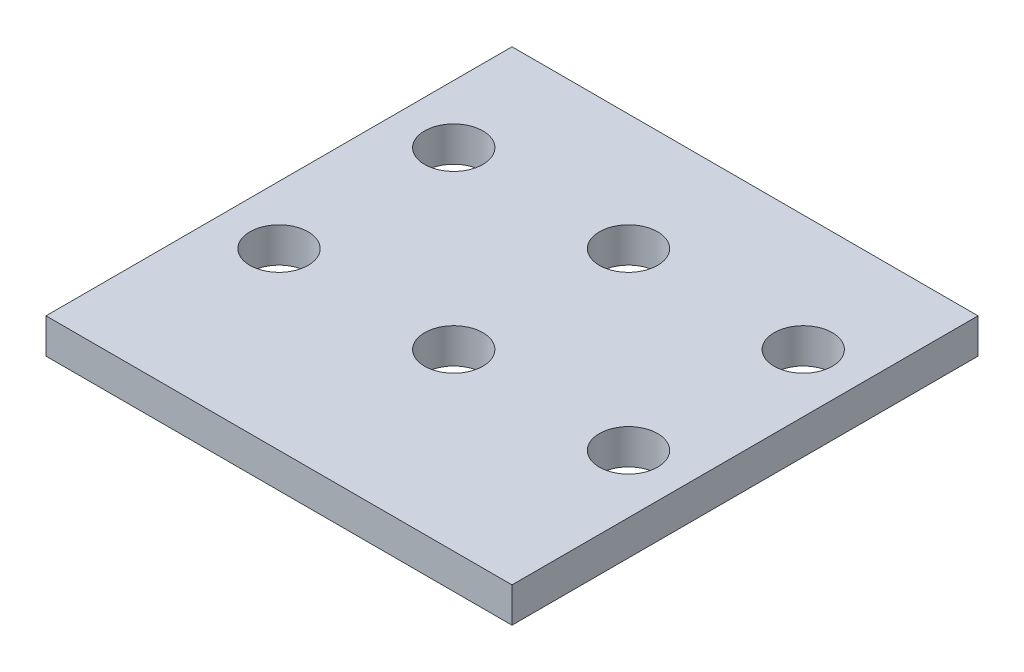
ISO-10303-21;
HEADER;
FILE_DESCRIPTION(('STEP AP214'),'2;1');
FILE_NAME('part.step','',(''),(''),'','','');
FILE_SCHEMA(('AUTOMOTIVE_DESIGN { 1 0 10303 214 1 1 1 1 }'));
ENDSEC;
DATA;
#1=APPLICATION_CONTEXT('core data for automotive mechanical design processes');
#2=APPLICATION_PROTOCOL_DEFINITION('international standard','automotive_design',2000,#1);
#3=PRODUCT_CONTEXT('',#1,'mechanical');
#4=PRODUCT('Part','Part','',(#3));
#5=PRODUCT_RELATED_PRODUCT_CATEGORY('part','',(#4));
#6=PRODUCT_DEFINITION_FORMATION('','',#4);
#7=PRODUCT_DEFINITION_CONTEXT('part definition',#1,'design');
#8=PRODUCT_DEFINITION('design','',#6,#7);
#9=PRODUCT_DEFINITION_SHAPE('','',#8);
#10=(LENGTH_UNIT() NAMED_UNIT(*) SI_UNIT(.MILLI.,.METRE.));
#11=(NAMED_UNIT(*) PLANE_ANGLE_UNIT() SI_UNIT($,.RADIAN.));
#12=(NAMED_UNIT(*) SI_UNIT($,.STERADIAN.) SOLID_ANGLE_UNIT());
#13=UNCERTAINTY_MEASURE_WITH_UNIT(LENGTH_MEASURE(1.E-05),#10,'distance_accuracy_value','');
#14=(GEOMETRIC_REPRESENTATION_CONTEXT(3) GLOBAL_UNCERTAINTY_ASSIGNED_CONTEXT((#13)) GLOBAL_UNIT_ASSIGNED_CONTEXT((#10,
#11,#12)) REPRESENTATION_CONTEXT('',''));
#15=CARTESIAN_POINT('',(0.,0.,0.));
#16=DIRECTION('',(0.,0.,1.));
#17=DIRECTION('',(1.,0.,0.));
#18=AXIS2_PLACEMENT_3D('',#15,#16,#17);
#19=CARTESIAN_POINT('',(19.05,0.,-12.7));
#20=DIRECTION('',(0.,1.,0.));
#21=DIRECTION('',(0.,0.,1.));
#22=AXIS2_PLACEMENT_3D('',#19,#20,#21);
#23=CYLINDRICAL_SURFACE('',#22,3.175);
#24=CARTESIAN_POINT('',(19.05,0.,-12.7));
#25=DIRECTION('',(0.,1.,0.));
#26=DIRECTION('',(0.,0.,1.));
#27=AXIS2_PLACEMENT_3D('',#24,#25,#26);
#28=CIRCLE('',#27,3.175);
#29=CARTESIAN_POINT('',(19.05,0.,-9.525));
#30=VERTEX_POINT('',#29);
#31=EDGE_CURVE('E45',#30,#30,#28,.T.);
#32=CARTESIAN_POINT('',(19.05,3.81,-12.7));
#33=DIRECTION('',(0.,1.,0.));
#34=DIRECTION('',(0.,0.,1.));
#35=AXIS2_PLACEMENT_3D('',#32,#33,#34);
#36=CIRCLE('',#35,3.175);
#37=CARTESIAN_POINT('',(19.05,3.81,-9.525));
#38=VERTEX_POINT('',#37);
#39=EDGE_CURVE('E11',#38,#38,#36,.T.);
#40=CARTESIAN_POINT('',(19.05,0.,-9.525));
#41=CARTESIAN_POINT('',(19.05,0.0396874999999999,-9.525));
#42=CARTESIAN_POINT('',(19.05,0.079375,-9.525));
#43=CARTESIAN_POINT('',(19.05,0.15875,-9.525));
#44=CARTESIAN_POINT('',(19.05,0.1984375,-9.525));
#45=CARTESIAN_POINT('',(19.05,0.2778125,-9.525));
#46=CARTESIAN_POINT('',(19.05,0.3175,-9.525));
#47=CARTESIAN_POINT('',(19.05,0.396875,-9.525));
#48=CARTESIAN_POINT('',(19.05,0.4365625,-9.525));
#49=CARTESIAN_POINT('',(19.05,0.5159375,-9.525));
#50=CARTESIAN_POINT('',(19.05,0.555625,-9.525));
#51=CARTESIAN_POINT('',(19.05,0.635,-9.525));
#52=CARTESIAN_POINT('',(19.05,0.6746875,-9.525));
#53=CARTESIAN_POINT('',(19.05,0.7540625,-9.525));
#54=CARTESIAN_POINT('',(19.05,0.79375,-9.525));
#55=CARTESIAN_POINT('',(19.05,0.873125,-9.525));
#56=CARTESIAN_POINT('',(19.05,0.9128125,-9.525));
#57=CARTESIAN_POINT('',(19.05,0.9921875,-9.525));
#58=CARTESIAN_POINT('',(19.05,1.031875,-9.525));
#59=CARTESIAN_POINT('',(19.05,1.11125,-9.525));
#60=CARTESIAN_POINT('',(19.05,1.1509375,-9.525));
#61=CARTESIAN_POINT('',(19.05,1.2303125,-9.525));
#62=CARTESIAN_POINT('',(19.05,1.27,-9.525));
#63=CARTESIAN_POINT('',(19.05,1.349375,-9.525));
#64=CARTESIAN_POINT('',(19.05,1.3890625,-9.525));
#65=CARTESIAN_POINT('',(19.05,1.4684375,-9.525));
#66=CARTESIAN_POINT('',(19.05,1.508125,-9.525));
#67=CARTESIAN_POINT('',(19.05,1.5875,-9.525));
#68=CARTESIAN_POINT('',(19.05,1.6271875,-9.525));
#69=CARTESIAN_POINT('',(19.05,1.7065625,-9.525));
#70=CARTESIAN_POINT('',(19.05,1.74625,-9.525));
#71=CARTESIAN_POINT('',(19.05,1.825625,-9.525));
#72=CARTESIAN_POINT('',(19.05,1.8653125,-9.525));
#73=CARTESIAN_POINT('',(19.05,1.9446875,-9.525));
#74=CARTESIAN_POINT('',(19.05,1.984375,-9.525));
#75=CARTESIAN_POINT('',(19.05,2.06375,-9.525));
#76=CARTESIAN_POINT('',(19.05,2.1034375,-9.525));
#77=CARTESIAN_POINT('',(19.05,2.1828125,-9.525));
#78=CARTESIAN_POINT('',(19.05,2.2225,-9.525));
#79=CARTESIAN_POINT('',(19.05,2.301875,-9.525));
#80=CARTESIAN_POINT('',(19.05,2.3415625,-9.525));
#81=CARTESIAN_POINT('',(19.05,2.4209375,-9.525));
#82=CARTESIAN_POINT('',(19.05,2.460625,-9.525));
#83=CARTESIAN_POINT('',(19.05,2.54,-9.525));
#84=CARTESIAN_POINT('',(19.05,2.5796875,-9.525));
#85=CARTESIAN_POINT('',(19.05,2.6590625,-9.525));
#86=CARTESIAN_POINT('',(19.05,2.69875,-9.525));
#87=CARTESIAN_POINT('',(19.05,2.778125,-9.525));
#88=CARTESIAN_POINT('',(19.05,2.8178125,-9.525));
#89=CARTESIAN_POINT('',(19.05,2.8971875,-9.525));
#90=CARTESIAN_POINT('',(19.05,2.936875,-9.525));
#91=CARTESIAN_POINT('',(19.05,3.01625,-9.525));
#92=CARTESIAN_POINT('',(19.05,3.0559375,-9.525));
#93=CARTESIAN_POINT('',(19.05,3.1353125,-9.525));
#94=CARTESIAN_POINT('',(19.05,3.175,-9.525));
#95=CARTESIAN_POINT('',(19.05,3.254375,-9.525));
#96=CARTESIAN_POINT('',(19.05,3.2940625,-9.525));
#97=CARTESIAN_POINT('',(19.05,3.3734375,-9.525));
#98=CARTESIAN_POINT('',(19.05,3.413125,-9.525));
#99=CARTESIAN_POINT('',(19.05,3.4925,-9.525));
#100=CARTESIAN_POINT('',(19.05,3.5321875,-9.525));
#101=CARTESIAN_POINT('',(19.05,3.6115625,-9.525));
#102=CARTESIAN_POINT('',(19.05,3.65125,-9.525));
#103=CARTESIAN_POINT('',(19.05,3.730625,-9.525));
#104=CARTESIAN_POINT('',(19.05,3.7703125,-9.525));
#105=CARTESIAN_POINT('',(19.05,3.81,-9.525));
#106=B_SPLINE_CURVE_WITH_KNOTS('',3,(#40,#41,#42,#43,#44,#45,#46,#47,#48,#49,#50,#51,#52,#53,
#54,#55,#56,#57,#58,#59,#60,#61,#62,#63,#64,#65,#66,#67,#68,#69,#70,#71,#72,#73,#74,#75,#76,#77,
#78,#79,#80,#81,#82,#83,#84,#85,#86,#87,#88,#89,#90,#91,#92,#93,#94,#95,#96,#97,#98,#99,#100,
#101,#102,#103,#104,#105),.UNSPECIFIED.,.F.,.F.,(4,2,2,2,2,2,2,2,2,2,2,2,2,2,2,2,2,2,2,2,2,2,2,
2,2,2,2,2,2,2,2,2,4),(0.,0.1190625,0.238125,0.3571875,0.47625,0.5953125,0.714375,0.8334375,
0.9525,1.0715625,1.190625,1.3096875,1.42875,1.5478125,1.666875,1.7859375,1.905,2.0240625,
2.143125,2.2621875,2.38125,2.5003125,2.619375,2.7384375,2.8575,2.9765625,3.095625,3.2146875,
3.33375,3.4528125,3.571875,3.6909375,3.81),.UNSPECIFIED.);
#107=EDGE_CURVE('BSEAM37',#30,#38,#106,.T.);
#108=ORIENTED_EDGE('',*,*,#31,.F.);
#109=ORIENTED_EDGE('',*,*,#39,.T.);
#110=ORIENTED_EDGE('',*,*,#107,.T.);
#111=ORIENTED_EDGE('',*,*,#107,.F.);
#112=EDGE_LOOP('',(#108,#110,#109,#111));
#113=FACE_BOUND('',#112,.T.);
#114=ADVANCED_FACE('F37',(#113),#23,.F.);
#115=CARTESIAN_POINT('',(19.05,0.,6.35));
#116=DIRECTION('',(0.,1.,0.));
#117=DIRECTION('',(0.,0.,1.));
#118=AXIS2_PLACEMENT_3D('',#115,#116,#117);
#119=CYLINDRICAL_SURFACE('',#118,3.175);
#120=CARTESIAN_POINT('',(19.05,0.,6.35));
#121=DIRECTION('',(0.,1.,0.));
#122=DIRECTION('',(0.,0.,1.));
#123=AXIS2_PLACEMENT_3D('',#120,#121,#122);
#124=CIRCLE('',#123,3.175);
#125=CARTESIAN_POINT('',(19.05,0.,9.525));
#126=VERTEX_POINT('',#125);
#127=EDGE_CURVE('E127',#126,#126,#124,.T.);
#128=CARTESIAN_POINT('',(19.05,3.81,6.35));
#129=DIRECTION('',(0.,1.,0.));
#130=DIRECTION('',(0.,0.,1.));
#131=AXIS2_PLACEMENT_3D('',#128,#129,#130);
#132=CIRCLE('',#131,3.175);
#133=CARTESIAN_POINT('',(19.05,3.81,9.525));
#134=VERTEX_POINT('',#133);
#135=EDGE_CURVE('E130',#134,#134,#132,.T.);
#136=CARTESIAN_POINT('',(19.05,0.,9.525));
#137=CARTESIAN_POINT('',(19.05,0.0396874999999999,9.525));
#138=CARTESIAN_POINT('',(19.05,0.079375,9.525));
#139=CARTESIAN_POINT('',(19.05,0.15875,9.525));
#140=CARTESIAN_POINT('',(19.05,0.1984375,9.525));
#141=CARTESIAN_POINT('',(19.05,0.2778125,9.525));
#142=CARTESIAN_POINT('',(19.05,0.3175,9.525));
#143=CARTESIAN_POINT('',(19.05,0.396875,9.525));
#144=CARTESIAN_POINT('',(19.05,0.4365625,9.525));
#145=CARTESIAN_POINT('',(19.05,0.5159375,9.525));
#146=CARTESIAN_POINT('',(19.05,0.555625,9.525));
#147=CARTESIAN_POINT('',(19.05,0.635,9.525));
#148=CARTESIAN_POINT('',(19.05,0.6746875,9.525));
#149=CARTESIAN_POINT('',(19.05,0.7540625,9.525));
#150=CARTESIAN_POINT('',(19.05,0.79375,9.525));
#151=CARTESIAN_POINT('',(19.05,0.873125,9.525));
#152=CARTESIAN_POINT('',(19.05,0.9128125,9.525));
#153=CARTESIAN_POINT('',(19.05,0.9921875,9.525));
#154=CARTESIAN_POINT('',(19.05,1.031875,9.525));
#155=CARTESIAN_POINT('',(19.05,1.11125,9.525));
#156=CARTESIAN_POINT('',(19.05,1.1509375,9.525));
#157=CARTESIAN_POINT('',(19.05,1.2303125,9.525));
#158=CARTESIAN_POINT('',(19.05,1.27,9.525));
#159=CARTESIAN_POINT('',(19.05,1.349375,9.525));
#160=CARTESIAN_POINT('',(19.05,1.3890625,9.525));
#161=CARTESIAN_POINT('',(19.05,1.4684375,9.525));
#162=CARTESIAN_POINT('',(19.05,1.508125,9.525));
#163=CARTESIAN_POINT('',(19.05,1.5875,9.525));
#164=CARTESIAN_POINT('',(19.05,1.6271875,9.525));
#165=CARTESIAN_POINT('',(19.05,1.7065625,9.525));
#166=CARTESIAN_POINT('',(19.05,1.74625,9.525));
#167=CARTESIAN_POINT('',(19.05,1.825625,9.525));
#168=CARTESIAN_POINT('',(19.05,1.8653125,9.525));
#169=CARTESIAN_POINT('',(19.05,1.9446875,9.525));
#170=CARTESIAN_POINT('',(19.05,1.984375,9.525));
#171=CARTESIAN_POINT('',(19.05,2.06375,9.525));
#172=CARTESIAN_POINT('',(19.05,2.1034375,9.525));
#173=CARTESIAN_POINT('',(19.05,2.1828125,9.525));
#174=CARTESIAN_POINT('',(19.05,2.2225,9.525));
#175=CARTESIAN_POINT('',(19.05,2.301875,9.525));
#176=CARTESIAN_POINT('',(19.05,2.3415625,9.525));
#177=CARTESIAN_POINT('',(19.05,2.4209375,9.525));
#178=CARTESIAN_POINT('',(19.05,2.460625,9.525));
#179=CARTESIAN_POINT('',(19.05,2.54,9.525));
#180=CARTESIAN_POINT('',(19.05,2.5796875,9.525));
#181=CARTESIAN_POINT('',(19.05,2.6590625,9.525));
#182=CARTESIAN_POINT('',(19.05,2.69875,9.525));
#183=CARTESIAN_POINT('',(19.05,2.778125,9.525));
#184=CARTESIAN_POINT('',(19.05,2.8178125,9.525));
#185=CARTESIAN_POINT('',(19.05,2.8971875,9.525));
#186=CARTESIAN_POINT('',(19.05,2.936875,9.525));
#187=CARTESIAN_POINT('',(19.05,3.01625,9.525));
#188=CARTESIAN_POINT('',(19.05,3.0559375,9.525));
#189=CARTESIAN_POINT('',(19.05,3.1353125,9.525));
#190=CARTESIAN_POINT('',(19.05,3.175,9.525));
#191=CARTESIAN_POINT('',(19.05,3.254375,9.525));
#192=CARTESIAN_POINT('',(19.05,3.2940625,9.525));
#193=CARTESIAN_POINT('',(19.05,3.3734375,9.525));
#194=CARTESIAN_POINT('',(19.05,3.413125,9.525));
#195=CARTESIAN_POINT('',(19.05,3.4925,9.525));
#196=CARTESIAN_POINT('',(19.05,3.5321875,9.525));
#197=CARTESIAN_POINT('',(19.05,3.6115625,9.525));
#198=CARTESIAN_POINT('',(19.05,3.65125,9.525));
#199=CARTESIAN_POINT('',(19.05,3.730625,9.525));
#200=CARTESIAN_POINT('',(19.05,3.7703125,9.525));
#201=CARTESIAN_POINT('',(19.05,3.81,9.525));
#202=B_SPLINE_CURVE_WITH_KNOTS('',3,(#136,#137,#138,#139,#140,#141,#142,#143,#144,#145,#146,
#147,#148,#149,#150,#151,#152,#153,#154,#155,#156,#157,#158,#159,#160,#161,#162,#163,#164,#165,
#166,#167,#168,#169,#170,#171,#172,#173,#174,#175,#176,#177,#178,#179,#180,#181,#182,#183,#184,
#185,#186,#187,#188,#189,#190,#191,#192,#193,#194,#195,#196,#197,#198,#199,#200,#201),
.UNSPECIFIED.,.F.,.F.,(4,2,2,2,2,2,2,2,2,2,2,2,2,2,2,2,2,2,2,2,2,2,2,2,2,2,2,2,2,2,2,2,4),(0.,
0.1190625,0.238125,0.3571875,0.47625,0.5953125,0.714375,0.8334375,0.9525,1.0715625,1.190625,
1.3096875,1.42875,1.5478125,1.666875,1.7859375,1.905,2.0240625,2.143125,2.2621875,2.38125,
2.5003125,2.619375,2.7384375,2.8575,2.9765625,3.095625,3.2146875,3.33375,3.4528125,3.571875,
3.6909375,3.81),.UNSPECIFIED.);
#203=EDGE_CURVE('BSEAM139',#126,#134,#202,.T.);
#204=ORIENTED_EDGE('',*,*,#127,.F.);
#205=ORIENTED_EDGE('',*,*,#135,.T.);
#206=ORIENTED_EDGE('',*,*,#203,.T.);
#207=ORIENTED_EDGE('',*,*,#203,.F.);
#208=EDGE_LOOP('',(#204,#206,#205,#207));
#209=FACE_BOUND('',#208,.T.);
#210=ADVANCED_FACE('F139',(#209),#119,.F.);
#211=CARTESIAN_POINT('',(0.,0.,-12.7));
#212=DIRECTION('',(0.,1.,0.));
#213=DIRECTION('',(0.,0.,1.));
#214=AXIS2_PLACEMENT_3D('',#211,#212,#213);
#215=CYLINDRICAL_SURFACE('',#214,3.175);
#216=CARTESIAN_POINT('',(0.,0.,-12.7));
#217=DIRECTION('',(0.,1.,0.));
#218=DIRECTION('',(0.,0.,1.));
#219=AXIS2_PLACEMENT_3D('',#216,#217,#218);
#220=CIRCLE('',#219,3.175);
#221=CARTESIAN_POINT('',(0.,0.,-9.525));
#222=VERTEX_POINT('',#221);
#223=EDGE_CURVE('E121',#222,#222,#220,.T.);
#224=CARTESIAN_POINT('',(0.,3.81,-12.7));
#225=DIRECTION('',(0.,1.,0.));
#226=DIRECTION('',(0.,0.,1.));
#227=AXIS2_PLACEMENT_3D('',#224,#225,#226);
#228=CIRCLE('',#227,3.175);
#229=CARTESIAN_POINT('',(0.,3.81,-9.525));
#230=VERTEX_POINT('',#229);
#231=EDGE_CURVE('E124',#230,#230,#228,.T.);
#232=CARTESIAN_POINT('',(0.,0.,-9.525));
#233=CARTESIAN_POINT('',(0.,0.0396874999999999,-9.525));
#234=CARTESIAN_POINT('',(0.,0.079375,-9.525));
#235=CARTESIAN_POINT('',(0.,0.15875,-9.525));
#236=CARTESIAN_POINT('',(0.,0.1984375,-9.525));
#237=CARTESIAN_POINT('',(0.,0.2778125,-9.525));
#238=CARTESIAN_POINT('',(0.,0.3175,-9.525));
#239=CARTESIAN_POINT('',(0.,0.396875,-9.525));
#240=CARTESIAN_POINT('',(0.,0.4365625,-9.525));
#241=CARTESIAN_POINT('',(0.,0.5159375,-9.525));
#242=CARTESIAN_POINT('',(0.,0.555625,-9.525));
#243=CARTESIAN_POINT('',(0.,0.635,-9.525));
#244=CARTESIAN_POINT('',(0.,0.6746875,-9.525));
#245=CARTESIAN_POINT('',(0.,0.7540625,-9.525));
#246=CARTESIAN_POINT('',(0.,0.79375,-9.525));
#247=CARTESIAN_POINT('',(0.,0.873125,-9.525));
#248=CARTESIAN_POINT('',(0.,0.9128125,-9.525));
#249=CARTESIAN_POINT('',(0.,0.9921875,-9.525));
#250=CARTESIAN_POINT('',(0.,1.031875,-9.525));
#251=CARTESIAN_POINT('',(0.,1.11125,-9.525));
#252=CARTESIAN_POINT('',(0.,1.1509375,-9.525));
#253=CARTESIAN_POINT('',(0.,1.2303125,-9.525));
#254=CARTESIAN_POINT('',(0.,1.27,-9.525));
#255=CARTESIAN_POINT('',(0.,1.349375,-9.525));
#256=CARTESIAN_POINT('',(0.,1.3890625,-9.525));
#257=CARTESIAN_POINT('',(0.,1.4684375,-9.525));
#258=CARTESIAN_POINT('',(0.,1.508125,-9.525));
#259=CARTESIAN_POINT('',(0.,1.5875,-9.525));
#260=CARTESIAN_POINT('',(0.,1.6271875,-9.525));
#261=CARTESIAN_POINT('',(0.,1.7065625,-9.525));
#262=CARTESIAN_POINT('',(0.,1.74625,-9.525));
#263=CARTESIAN_POINT('',(0.,1.825625,-9.525));
#264=CARTESIAN_POINT('',(0.,1.8653125,-9.525));
#265=CARTESIAN_POINT('',(0.,1.9446875,-9.525));
#266=CARTESIAN_POINT('',(0.,1.984375,-9.525));
#267=CARTESIAN_POINT('',(0.,2.06375,-9.525));
#268=CARTESIAN_POINT('',(0.,2.1034375,-9.525));
#269=CARTESIAN_POINT('',(0.,2.1828125,-9.525));
#270=CARTESIAN_POINT('',(0.,2.2225,-9.525));
#271=CARTESIAN_POINT('',(0.,2.301875,-9.525));
#272=CARTESIAN_POINT('',(0.,2.3415625,-9.525));
#273=CARTESIAN_POINT('',(0.,2.4209375,-9.525));
#274=CARTESIAN_POINT('',(0.,2.460625,-9.525));
#275=CARTESIAN_POINT('',(0.,2.54,-9.525));
#276=CARTESIAN_POINT('',(0.,2.5796875,-9.525));
#277=CARTESIAN_POINT('',(0.,2.6590625,-9.525));
#278=CARTESIAN_POINT('',(0.,2.69875,-9.525));
#279=CARTESIAN_POINT('',(0.,2.778125,-9.525));
#280=CARTESIAN_POINT('',(0.,2.8178125,-9.525));
#281=CARTESIAN_POINT('',(0.,2.8971875,-9.525));
#282=CARTESIAN_POINT('',(0.,2.936875,-9.525));
#283=CARTESIAN_POINT('',(0.,3.01625,-9.525));
#284=CARTESIAN_POINT('',(0.,3.0559375,-9.525));
#285=CARTESIAN_POINT('',(0.,3.1353125,-9.525));
#286=CARTESIAN_POINT('',(0.,3.175,-9.525));
#287=CARTESIAN_POINT('',(0.,3.254375,-9.525));
#288=CARTESIAN_POINT('',(0.,3.2940625,-9.525));
#289=CARTESIAN_POINT('',(0.,3.3734375,-9.525));
#290=CARTESIAN_POINT('',(0.,3.413125,-9.525));
#291=CARTESIAN_POINT('',(0.,3.4925,-9.525));
#292=CARTESIAN_POINT('',(0.,3.5321875,-9.525));
#293=CARTESIAN_POINT('',(0.,3.6115625,-9.525));
#294=CARTESIAN_POINT('',(0.,3.65125,-9.525));
#295=CARTESIAN_POINT('',(0.,3.730625,-9.525));
#296=CARTESIAN_POINT('',(0.,3.7703125,-9.525));
#297=CARTESIAN_POINT('',(0.,3.81,-9.525));
#298=B_SPLINE_CURVE_WITH_KNOTS('',3,(#232,#233,#234,#235,#236,#237,#238,#239,#240,#241,#242,
#243,#244,#245,#246,#247,#248,#249,#250,#251,#252,#253,#254,#255,#256,#257,#258,#259,#260,#261,
#262,#263,#264,#265,#266,#267,#268,#269,#270,#271,#272,#273,#274,#275,#276,#277,#278,#279,#280,
#281,#282,#283,#284,#285,#286,#287,#288,#289,#290,#291,#292,#293,#294,#295,#296,#297),
.UNSPECIFIED.,.F.,.F.,(4,2,2,2,2,2,2,2,2,2,2,2,2,2,2,2,2,2,2,2,2,2,2,2,2,2,2,2,2,2,2,2,4),(0.,
0.1190625,0.238125,0.3571875,0.47625,0.5953125,0.714375,0.8334375,0.9525,1.0715625,1.190625,
1.3096875,1.42875,1.5478125,1.666875,1.7859375,1.905,2.0240625,2.143125,2.2621875,2.38125,
2.5003125,2.619375,2.7384375,2.8575,2.9765625,3.095625,3.2146875,3.33375,3.4528125,3.571875,
3.6909375,3.81),.UNSPECIFIED.);
#299=EDGE_CURVE('BSEAM170',#222,#230,#298,.T.);
#300=ORIENTED_EDGE('',*,*,#223,.F.);
#301=ORIENTED_EDGE('',*,*,#231,.T.);
#302=ORIENTED_EDGE('',*,*,#299,.T.);
#303=ORIENTED_EDGE('',*,*,#299,.F.);
#304=EDGE_LOOP('',(#300,#302,#301,#303));
#305=FACE_BOUND('',#304,.T.);
#306=ADVANCED_FACE('F170',(#305),#215,.F.);
#307=CARTESIAN_POINT('',(0.,0.,6.35));
#308=DIRECTION('',(0.,1.,0.));
#309=DIRECTION('',(0.,0.,1.));
#310=AXIS2_PLACEMENT_3D('',#307,#308,#309);
#311=CYLINDRICAL_SURFACE('',#310,3.175);
#312=CARTESIAN_POINT('',(0.,0.,6.35));
#313=DIRECTION('',(0.,1.,0.));
#314=DIRECTION('',(0.,0.,1.));
#315=AXIS2_PLACEMENT_3D('',#312,#313,#314);
#316=CIRCLE('',#315,3.175);
#317=CARTESIAN_POINT('',(0.,0.,9.525));
#318=VERTEX_POINT('',#317);
#319=EDGE_CURVE('E115',#318,#318,#316,.T.);
#320=CARTESIAN_POINT('',(0.,3.81,6.35));
#321=DIRECTION('',(0.,1.,0.));
#322=DIRECTION('',(0.,0.,1.));
#323=AXIS2_PLACEMENT_3D('',#320,#321,#322);
#324=CIRCLE('',#323,3.175);
#325=CARTESIAN_POINT('',(0.,3.81,9.525));
#326=VERTEX_POINT('',#325);
#327=EDGE_CURVE('E118',#326,#326,#324,.T.);
#328=CARTESIAN_POINT('',(0.,0.,9.525));
#329=CARTESIAN_POINT('',(0.,0.0396874999999999,9.525));
#330=CARTESIAN_POINT('',(0.,0.079375,9.525));
#331=CARTESIAN_POINT('',(0.,0.15875,9.525));
#332=CARTESIAN_POINT('',(0.,0.1984375,9.525));
#333=CARTESIAN_POINT('',(0.,0.2778125,9.525));
#334=CARTESIAN_POINT('',(0.,0.3175,9.525));
#335=CARTESIAN_POINT('',(0.,0.396875,9.525));
#336=CARTESIAN_POINT('',(0.,0.4365625,9.525));
#337=CARTESIAN_POINT('',(0.,0.5159375,9.525));
#338=CARTESIAN_POINT('',(0.,0.555625,9.525));
#339=CARTESIAN_POINT('',(0.,0.635,9.525));
#340=CARTESIAN_POINT('',(0.,0.6746875,9.525));
#341=CARTESIAN_POINT('',(0.,0.7540625,9.525));
#342=CARTESIAN_POINT('',(0.,0.79375,9.525));
#343=CARTESIAN_POINT('',(0.,0.873125,9.525));
#344=CARTESIAN_POINT('',(0.,0.9128125,9.525));
#345=CARTESIAN_POINT('',(0.,0.9921875,9.525));
#346=CARTESIAN_POINT('',(0.,1.031875,9.525));
#347=CARTESIAN_POINT('',(0.,1.11125,9.525));
#348=CARTESIAN_POINT('',(0.,1.1509375,9.525));
#349=CARTESIAN_POINT('',(0.,1.2303125,9.525));
#350=CARTESIAN_POINT('',(0.,1.27,9.525));
#351=CARTESIAN_POINT('',(0.,1.349375,9.525));
#352=CARTESIAN_POINT('',(0.,1.3890625,9.525));
#353=CARTESIAN_POINT('',(0.,1.4684375,9.525));
#354=CARTESIAN_POINT('',(0.,1.508125,9.525));
#355=CARTESIAN_POINT('',(0.,1.5875,9.525));
#356=CARTESIAN_POINT('',(0.,1.6271875,9.525));
#357=CARTESIAN_POINT('',(0.,1.7065625,9.525));
#358=CARTESIAN_POINT('',(0.,1.74625,9.525));
#359=CARTESIAN_POINT('',(0.,1.825625,9.525));
#360=CARTESIAN_POINT('',(0.,1.8653125,9.525));
#361=CARTESIAN_POINT('',(0.,1.9446875,9.525));
#362=CARTESIAN_POINT('',(0.,1.984375,9.525));
#363=CARTESIAN_POINT('',(0.,2.06375,9.525));
#364=CARTESIAN_POINT('',(0.,2.1034375,9.525));
#365=CARTESIAN_POINT('',(0.,2.1828125,9.525));
#366=CARTESIAN_POINT('',(0.,2.2225,9.525));
#367=CARTESIAN_POINT('',(0.,2.301875,9.525));
#368=CARTESIAN_POINT('',(0.,2.3415625,9.525));
#369=CARTESIAN_POINT('',(0.,2.4209375,9.525));
#370=CARTESIAN_POINT('',(0.,2.460625,9.525));
#371=CARTESIAN_POINT('',(0.,2.54,9.525));
#372=CARTESIAN_POINT('',(0.,2.5796875,9.525));
#373=CARTESIAN_POINT('',(0.,2.6590625,9.525));
#374=CARTESIAN_POINT('',(0.,2.69875,9.525));
#375=CARTESIAN_POINT('',(0.,2.778125,9.525));
#376=CARTESIAN_POINT('',(0.,2.8178125,9.525));
#377=CARTESIAN_POINT('',(0.,2.8971875,9.525));
#378=CARTESIAN_POINT('',(0.,2.936875,9.525));
#379=CARTESIAN_POINT('',(0.,3.01625,9.525));
#380=CARTESIAN_POINT('',(0.,3.0559375,9.525));
#381=CARTESIAN_POINT('',(0.,3.1353125,9.525));
#382=CARTESIAN_POINT('',(0.,3.175,9.525));
#383=CARTESIAN_POINT('',(0.,3.254375,9.525));
#384=CARTESIAN_POINT('',(0.,3.2940625,9.525));
#385=CARTESIAN_POINT('',(0.,3.3734375,9.525));
#386=CARTESIAN_POINT('',(0.,3.413125,9.525));
#387=CARTESIAN_POINT('',(0.,3.4925,9.525));
#388=CARTESIAN_POINT('',(0.,3.5321875,9.525));
#389=CARTESIAN_POINT('',(0.,3.6115625,9.525));
#390=CARTESIAN_POINT('',(0.,3.65125,9.525));
#391=CARTESIAN_POINT('',(0.,3.730625,9.525));
#392=CARTESIAN_POINT('',(0.,3.7703125,9.525));
#393=CARTESIAN_POINT('',(0.,3.81,9.525));
#394=B_SPLINE_CURVE_WITH_KNOTS('',3,(#328,#329,#330,#331,#332,#333,#334,#335,#336,#337,#338,
#339,#340,#341,#342,#343,#344,#345,#346,#347,#348,#349,#350,#351,#352,#353,#354,#355,#356,#357,
#358,#359,#360,#361,#362,#363,#364,#365,#366,#367,#368,#369,#370,#371,#372,#373,#374,#375,#376,
#377,#378,#379,#380,#381,#382,#383,#384,#385,#386,#387,#388,#389,#390,#391,#392,#393),
.UNSPECIFIED.,.F.,.F.,(4,2,2,2,2,2,2,2,2,2,2,2,2,2,2,2,2,2,2,2,2,2,2,2,2,2,2,2,2,2,2,2,4),(0.,
0.1190625,0.238125,0.3571875,0.47625,0.5953125,0.714375,0.8334375,0.9525,1.0715625,1.190625,
1.3096875,1.42875,1.5478125,1.666875,1.7859375,1.905,2.0240625,2.143125,2.2621875,2.38125,
2.5003125,2.619375,2.7384375,2.8575,2.9765625,3.095625,3.2146875,3.33375,3.4528125,3.571875,
3.6909375,3.81),.UNSPECIFIED.);
#395=EDGE_CURVE('BSEAM166',#318,#326,#394,.T.);
#396=ORIENTED_EDGE('',*,*,#319,.F.);
#397=ORIENTED_EDGE('',*,*,#327,.T.);
#398=ORIENTED_EDGE('',*,*,#395,.T.);
#399=ORIENTED_EDGE('',*,*,#395,.F.);
#400=EDGE_LOOP('',(#396,#398,#397,#399));
#401=FACE_BOUND('',#400,.T.);
#402=ADVANCED_FACE('F166',(#401),#311,.F.);
#403=CARTESIAN_POINT('',(25.4,3.81,25.4));
#404=DIRECTION('',(-1.,0.,0.));
#405=DIRECTION('',(0.,0.,1.));
#406=AXIS2_PLACEMENT_3D('',#403,#404,#405);
#407=PLANE('',#406);
#408=DIRECTION('',(0.,0.,-1.));
#409=VECTOR('',#408,1.);
#410=CARTESIAN_POINT('',(25.4,0.,25.4));
#411=LINE('',#410,#409);
#412=CARTESIAN_POINT('',(25.4,0.,25.4));
#413=VERTEX_POINT('',#412);
#414=CARTESIAN_POINT('',(25.4,0.,-25.4));
#415=VERTEX_POINT('',#414);
#416=EDGE_CURVE('E105',#413,#415,#411,.T.);
#417=ORIENTED_EDGE('',*,*,#416,.T.);
#418=DIRECTION('',(0.,-1.,0.));
#419=VECTOR('',#418,1.);
#420=CARTESIAN_POINT('',(25.4,3.81,-25.4));
#421=LINE('',#420,#419);
#422=CARTESIAN_POINT('',(25.4,3.81,-25.4));
#423=VERTEX_POINT('',#422);
#424=EDGE_CURVE('E96',#423,#415,#421,.T.);
#425=ORIENTED_EDGE('',*,*,#424,.F.);
#426=DIRECTION('',(0.,0.,-1.));
#427=VECTOR('',#426,1.);
#428=CARTESIAN_POINT('',(25.4,3.81,25.4));
#429=LINE('',#428,#427);
#430=CARTESIAN_POINT('',(25.4,3.81,25.4));
#431=VERTEX_POINT('',#430);
#432=EDGE_CURVE('E90',#431,#423,#429,.T.);
#433=ORIENTED_EDGE('',*,*,#432,.F.);
#434=DIRECTION('',(0.,-1.,0.));
#435=VECTOR('',#434,1.);
#436=CARTESIAN_POINT('',(25.4,3.81,25.4));
#437=LINE('',#436,#435);
#438=EDGE_CURVE('E101',#431,#413,#437,.T.);
#439=ORIENTED_EDGE('',*,*,#438,.T.);
#440=EDGE_LOOP('',(#417,#425,#433,#439));
#441=FACE_BOUND('',#440,.T.);
#442=ADVANCED_FACE('F163',(#441),#407,.F.);
#443=CARTESIAN_POINT('',(-25.4,3.81,-25.4));
#444=DIRECTION('',(0.,0.,1.));
#445=DIRECTION('',(1.,0.,0.));
#446=AXIS2_PLACEMENT_3D('',#443,#444,#445);
#447=PLANE('',#446);
#448=DIRECTION('',(-1.,0.,0.));
#449=VECTOR('',#448,1.);
#450=CARTESIAN_POINT('',(-25.4,0.,-25.4));
#451=LINE('',#450,#449);
#452=CARTESIAN_POINT('',(-25.4,0.,-25.4));
#453=VERTEX_POINT('',#452);
#454=EDGE_CURVE('E95',#415,#453,#451,.T.);
#455=ORIENTED_EDGE('',*,*,#454,.T.);
#456=DIRECTION('',(0.,-1.,0.));
#457=VECTOR('',#456,1.);
#458=CARTESIAN_POINT('',(-25.4,3.81,-25.4));
#459=LINE('',#458,#457);
#460=CARTESIAN_POINT('',(-25.4,3.81,-25.4));
#461=VERTEX_POINT('',#460);
#462=EDGE_CURVE('E93',#461,#453,#459,.T.);
#463=ORIENTED_EDGE('',*,*,#462,.F.);
#464=DIRECTION('',(-1.,0.,0.));
#465=VECTOR('',#464,1.);
#466=CARTESIAN_POINT('',(-25.4,3.81,-25.4));
#467=LINE('',#466,#465);
#468=EDGE_CURVE('E84',#423,#461,#467,.T.);
#469=ORIENTED_EDGE('',*,*,#468,.F.);
#470=ORIENTED_EDGE('',*,*,#424,.T.);
#471=EDGE_LOOP('',(#455,#463,#469,#470));
#472=FACE_BOUND('',#471,.T.);
#473=ADVANCED_FACE('F94',(#472),#447,.F.);
#474=CARTESIAN_POINT('',(-25.4,3.81,25.4));
#475=DIRECTION('',(1.,0.,0.));
#476=DIRECTION('',(0.,0.,-1.));
#477=AXIS2_PLACEMENT_3D('',#474,#475,#476);
#478=PLANE('',#477);
#479=DIRECTION('',(0.,0.,1.));
#480=VECTOR('',#479,1.);
#481=CARTESIAN_POINT('',(-25.4,0.,25.4));
#482=LINE('',#481,#480);
#483=CARTESIAN_POINT('',(-25.4,0.,25.4));
#484=VERTEX_POINT('',#483);
#485=EDGE_CURVE('E70',#453,#484,#482,.T.);
#486=ORIENTED_EDGE('',*,*,#485,.T.);
#487=DIRECTION('',(0.,-1.,0.));
#488=VECTOR('',#487,1.);
#489=CARTESIAN_POINT('',(-25.4,3.81,25.4));
#490=LINE('',#489,#488);
#491=CARTESIAN_POINT('',(-25.4,3.81,25.4));
#492=VERTEX_POINT('',#491);
#493=EDGE_CURVE('E97',#492,#484,#490,.T.);
#494=ORIENTED_EDGE('',*,*,#493,.F.);
#495=DIRECTION('',(0.,0.,1.));
#496=VECTOR('',#495,1.);
#497=CARTESIAN_POINT('',(-25.4,3.81,25.4));
#498=LINE('',#497,#496);
#499=EDGE_CURVE('E88',#461,#492,#498,.T.);
#500=ORIENTED_EDGE('',*,*,#499,.F.);
#501=ORIENTED_EDGE('',*,*,#462,.T.);
#502=EDGE_LOOP('',(#486,#494,#500,#501));
#503=FACE_BOUND('',#502,.T.);
#504=ADVANCED_FACE('F99',(#503),#478,.F.);
#505=CARTESIAN_POINT('',(-25.4,3.81,25.4));
#506=DIRECTION('',(0.,0.,-1.));
#507=DIRECTION('',(-1.,0.,0.));
#508=AXIS2_PLACEMENT_3D('',#505,#506,#507);
#509=PLANE('',#508);
#510=DIRECTION('',(1.,0.,0.));
#511=VECTOR('',#510,1.);
#512=CARTESIAN_POINT('',(-25.4,0.,25.4));
#513=LINE('',#512,#511);
#514=EDGE_CURVE('E76',#484,#413,#513,.T.);
#515=ORIENTED_EDGE('',*,*,#514,.T.);
#516=ORIENTED_EDGE('',*,*,#438,.F.);
#517=DIRECTION('',(1.,0.,0.));
#518=VECTOR('',#517,1.);
#519=CARTESIAN_POINT('',(-25.4,3.81,25.4));
#520=LINE('',#519,#518);
#521=EDGE_CURVE('E53',#492,#431,#520,.T.);
#522=ORIENTED_EDGE('',*,*,#521,.F.);
#523=ORIENTED_EDGE('',*,*,#493,.T.);
#524=EDGE_LOOP('',(#515,#516,#522,#523));
#525=FACE_BOUND('',#524,.T.);
#526=ADVANCED_FACE('F143',(#525),#509,.F.);
#527=CARTESIAN_POINT('',(0.,3.81,0.));
#528=DIRECTION('',(0.,-1.,0.));
#529=DIRECTION('',(0.,0.,-1.));
#530=AXIS2_PLACEMENT_3D('',#527,#528,#529);
#531=PLANE('',#530);
#532=CARTESIAN_POINT('',(-19.05,3.81,-12.7));
#533=DIRECTION('',(0.,1.,0.));
#534=DIRECTION('',(0.,0.,1.));
#535=AXIS2_PLACEMENT_3D('',#532,#533,#534);
#536=CIRCLE('',#535,3.175);
#537=CARTESIAN_POINT('',(-19.05,3.81,-9.525));
#538=VERTEX_POINT('',#537);
#539=EDGE_CURVE('E285',#538,#538,#536,.T.);
#540=ORIENTED_EDGE('',*,*,#539,.F.);
#541=EDGE_LOOP('',(#540));
#542=FACE_BOUND('',#541,.T.);
#543=CARTESIAN_POINT('',(-19.05,3.81,6.35));
#544=DIRECTION('',(0.,1.,0.));
#545=DIRECTION('',(0.,0.,1.));
#546=AXIS2_PLACEMENT_3D('',#543,#544,#545);
#547=CIRCLE('',#546,3.175);
#548=CARTESIAN_POINT('',(-19.05,3.81,9.525));
#549=VERTEX_POINT('',#548);
#550=EDGE_CURVE('E286',#549,#549,#547,.T.);
#551=ORIENTED_EDGE('',*,*,#550,.F.);
#552=EDGE_LOOP('',(#551));
#553=FACE_BOUND('',#552,.T.);
#554=ORIENTED_EDGE('',*,*,#432,.T.);
#555=ORIENTED_EDGE('',*,*,#468,.T.);
#556=ORIENTED_EDGE('',*,*,#499,.T.);
#557=ORIENTED_EDGE('',*,*,#521,.T.);
#558=EDGE_LOOP('',(#554,#555,#556,#557));
#559=FACE_BOUND('',#558,.T.);
#560=ORIENTED_EDGE('',*,*,#327,.F.);
#561=EDGE_LOOP('',(#560));
#562=FACE_BOUND('',#561,.T.);
#563=ORIENTED_EDGE('',*,*,#231,.F.);
#564=EDGE_LOOP('',(#563));
#565=FACE_BOUND('',#564,.T.);
#566=ORIENTED_EDGE('',*,*,#135,.F.);
#567=EDGE_LOOP('',(#566));
#568=FACE_BOUND('',#567,.T.);
#569=ORIENTED_EDGE('',*,*,#39,.F.);
#570=EDGE_LOOP('',(#569));
#571=FACE_BOUND('',#570,.T.);
#572=ADVANCED_FACE('F85',(#542,#553,#559,#562,#565,#568,#571),#531,.F.);
#573=CARTESIAN_POINT('',(0.,0.,0.));
#574=DIRECTION('',(0.,-1.,0.));
#575=DIRECTION('',(0.,0.,-1.));
#576=AXIS2_PLACEMENT_3D('',#573,#574,#575);
#577=PLANE('',#576);
#578=CARTESIAN_POINT('',(-19.05,0.,-12.7));
#579=DIRECTION('',(0.,1.,0.));
#580=DIRECTION('',(0.,0.,1.));
#581=AXIS2_PLACEMENT_3D('',#578,#579,#580);
#582=CIRCLE('',#581,3.175);
#583=CARTESIAN_POINT('',(-19.05,0.,-9.525));
#584=VERTEX_POINT('',#583);
#585=EDGE_CURVE('E283',#584,#584,#582,.T.);
#586=ORIENTED_EDGE('',*,*,#585,.T.);
#587=EDGE_LOOP('',(#586));
#588=FACE_BOUND('',#587,.T.);
#589=CARTESIAN_POINT('',(-19.05,0.,6.35));
#590=DIRECTION('',(0.,1.,0.));
#591=DIRECTION('',(0.,0.,1.));
#592=AXIS2_PLACEMENT_3D('',#589,#590,#591);
#593=CIRCLE('',#592,3.175);
#594=CARTESIAN_POINT('',(-19.05,0.,9.525));
#595=VERTEX_POINT('',#594);
#596=EDGE_CURVE('E108',#595,#595,#593,.T.);
#597=ORIENTED_EDGE('',*,*,#596,.T.);
#598=EDGE_LOOP('',(#597));
#599=FACE_BOUND('',#598,.T.);
#600=ORIENTED_EDGE('',*,*,#416,.F.);
#601=ORIENTED_EDGE('',*,*,#514,.F.);
#602=ORIENTED_EDGE('',*,*,#485,.F.);
#603=ORIENTED_EDGE('',*,*,#454,.F.);
#604=EDGE_LOOP('',(#600,#601,#602,#603));
#605=FACE_BOUND('',#604,.T.);
#606=ORIENTED_EDGE('',*,*,#319,.T.);
#607=EDGE_LOOP('',(#606));
#608=FACE_BOUND('',#607,.T.);
#609=ORIENTED_EDGE('',*,*,#223,.T.);
#610=EDGE_LOOP('',(#609));
#611=FACE_BOUND('',#610,.T.);
#612=ORIENTED_EDGE('',*,*,#127,.T.);
#613=EDGE_LOOP('',(#612));
#614=FACE_BOUND('',#613,.T.);
#615=ORIENTED_EDGE('',*,*,#31,.T.);
#616=EDGE_LOOP('',(#615));
#617=FACE_BOUND('',#616,.T.);
#618=ADVANCED_FACE('F135',(#588,#599,#605,#608,#611,#614,#617),#577,.T.);
#619=CARTESIAN_POINT('',(-19.05,0.,6.35));
#620=DIRECTION('',(0.,1.,0.));
#621=DIRECTION('',(0.,0.,1.));
#622=AXIS2_PLACEMENT_3D('',#619,#620,#621);
#623=CYLINDRICAL_SURFACE('',#622,3.175);
#624=CARTESIAN_POINT('',(-19.05,0.,9.525));
#625=CARTESIAN_POINT('',(-19.05,0.0396874999999999,9.525));
#626=CARTESIAN_POINT('',(-19.05,0.079375,9.525));
#627=CARTESIAN_POINT('',(-19.05,0.15875,9.525));
#628=CARTESIAN_POINT('',(-19.05,0.1984375,9.525));
#629=CARTESIAN_POINT('',(-19.05,0.2778125,9.525));
#630=CARTESIAN_POINT('',(-19.05,0.3175,9.525));
#631=CARTESIAN_POINT('',(-19.05,0.396875,9.525));
#632=CARTESIAN_POINT('',(-19.05,0.4365625,9.525));
#633=CARTESIAN_POINT('',(-19.05,0.5159375,9.525));
#634=CARTESIAN_POINT('',(-19.05,0.555625,9.525));
#635=CARTESIAN_POINT('',(-19.05,0.635,9.525));
#636=CARTESIAN_POINT('',(-19.05,0.6746875,9.525));
#637=CARTESIAN_POINT('',(-19.05,0.7540625,9.525));
#638=CARTESIAN_POINT('',(-19.05,0.79375,9.525));
#639=CARTESIAN_POINT('',(-19.05,0.873125,9.525));
#640=CARTESIAN_POINT('',(-19.05,0.9128125,9.525));
#641=CARTESIAN_POINT('',(-19.05,0.9921875,9.525));
#642=CARTESIAN_POINT('',(-19.05,1.031875,9.525));
#643=CARTESIAN_POINT('',(-19.05,1.11125,9.525));
#644=CARTESIAN_POINT('',(-19.05,1.1509375,9.525));
#645=CARTESIAN_POINT('',(-19.05,1.2303125,9.525));
#646=CARTESIAN_POINT('',(-19.05,1.27,9.525));
#647=CARTESIAN_POINT('',(-19.05,1.349375,9.525));
#648=CARTESIAN_POINT('',(-19.05,1.3890625,9.525));
#649=CARTESIAN_POINT('',(-19.05,1.4684375,9.525));
#650=CARTESIAN_POINT('',(-19.05,1.508125,9.525));
#651=CARTESIAN_POINT('',(-19.05,1.5875,9.525));
#652=CARTESIAN_POINT('',(-19.05,1.6271875,9.525));
#653=CARTESIAN_POINT('',(-19.05,1.7065625,9.525));
#654=CARTESIAN_POINT('',(-19.05,1.74625,9.525));
#655=CARTESIAN_POINT('',(-19.05,1.825625,9.525));
#656=CARTESIAN_POINT('',(-19.05,1.8653125,9.525));
#657=CARTESIAN_POINT('',(-19.05,1.9446875,9.525));
#658=CARTESIAN_POINT('',(-19.05,1.984375,9.525));
#659=CARTESIAN_POINT('',(-19.05,2.06375,9.525));
#660=CARTESIAN_POINT('',(-19.05,2.1034375,9.525));
#661=CARTESIAN_POINT('',(-19.05,2.1828125,9.525));
#662=CARTESIAN_POINT('',(-19.05,2.2225,9.525));
#663=CARTESIAN_POINT('',(-19.05,2.301875,9.525));
#664=CARTESIAN_POINT('',(-19.05,2.3415625,9.525));
#665=CARTESIAN_POINT('',(-19.05,2.4209375,9.525));
#666=CARTESIAN_POINT('',(-19.05,2.460625,9.525));
#667=CARTESIAN_POINT('',(-19.05,2.54,9.525));
#668=CARTESIAN_POINT('',(-19.05,2.5796875,9.525));
#669=CARTESIAN_POINT('',(-19.05,2.6590625,9.525));
#670=CARTESIAN_POINT('',(-19.05,2.69875,9.525));
#671=CARTESIAN_POINT('',(-19.05,2.778125,9.525));
#672=CARTESIAN_POINT('',(-19.05,2.8178125,9.525));
#673=CARTESIAN_POINT('',(-19.05,2.8971875,9.525));
#674=CARTESIAN_POINT('',(-19.05,2.936875,9.525));
#675=CARTESIAN_POINT('',(-19.05,3.01625,9.525));
#676=CARTESIAN_POINT('',(-19.05,3.0559375,9.525));
#677=CARTESIAN_POINT('',(-19.05,3.1353125,9.525));
#678=CARTESIAN_POINT('',(-19.05,3.175,9.525));
#679=CARTESIAN_POINT('',(-19.05,3.254375,9.525));
#680=CARTESIAN_POINT('',(-19.05,3.2940625,9.525));
#681=CARTESIAN_POINT('',(-19.05,3.3734375,9.525));
#682=CARTESIAN_POINT('',(-19.05,3.413125,9.525));
#683=CARTESIAN_POINT('',(-19.05,3.4925,9.525));
#684=CARTESIAN_POINT('',(-19.05,3.5321875,9.525));
#685=CARTESIAN_POINT('',(-19.05,3.6115625,9.525));
#686=CARTESIAN_POINT('',(-19.05,3.65125,9.525));
#687=CARTESIAN_POINT('',(-19.05,3.730625,9.525));
#688=CARTESIAN_POINT('',(-19.05,3.7703125,9.525));
#689=CARTESIAN_POINT('',(-19.05,3.81,9.525));
#690=B_SPLINE_CURVE_WITH_KNOTS('',3,(#624,#625,#626,#627,#628,#629,#630,#631,#632,#633,#634,
#635,#636,#637,#638,#639,#640,#641,#642,#643,#644,#645,#646,#647,#648,#649,#650,#651,#652,#653,
#654,#655,#656,#657,#658,#659,#660,#661,#662,#663,#664,#665,#666,#667,#668,#669,#670,#671,#672,
#673,#674,#675,#676,#677,#678,#679,#680,#681,#682,#683,#684,#685,#686,#687,#688,#689),
.UNSPECIFIED.,.F.,.F.,(4,2,2,2,2,2,2,2,2,2,2,2,2,2,2,2,2,2,2,2,2,2,2,2,2,2,2,2,2,2,2,2,4),(0.,
0.1190625,0.238125,0.3571875,0.47625,0.5953125,0.714375,0.8334375,0.9525,1.0715625,1.190625,
1.3096875,1.42875,1.5478125,1.666875,1.7859375,1.905,2.0240625,2.143125,2.2621875,2.38125,
2.5003125,2.619375,2.7384375,2.8575,2.9765625,3.095625,3.2146875,3.33375,3.4528125,3.571875,
3.6909375,3.81),.UNSPECIFIED.);
#691=EDGE_CURVE('BSEAM150',#595,#549,#690,.T.);
#692=ORIENTED_EDGE('',*,*,#596,.F.);
#693=ORIENTED_EDGE('',*,*,#550,.T.);
#694=ORIENTED_EDGE('',*,*,#691,.T.);
#695=ORIENTED_EDGE('',*,*,#691,.F.);
#696=EDGE_LOOP('',(#692,#694,#693,#695));
#697=FACE_BOUND('',#696,.T.);
#698=ADVANCED_FACE('F150',(#697),#623,.F.);
#699=CARTESIAN_POINT('',(-19.05,0.,-12.7));
#700=DIRECTION('',(0.,1.,0.));
#701=DIRECTION('',(0.,0.,1.));
#702=AXIS2_PLACEMENT_3D('',#699,#700,#701);
#703=CYLINDRICAL_SURFACE('',#702,3.175);
#704=CARTESIAN_POINT('',(-19.05,0.,-9.525));
#705=CARTESIAN_POINT('',(-19.05,0.0396874999999999,-9.525));
#706=CARTESIAN_POINT('',(-19.05,0.079375,-9.525));
#707=CARTESIAN_POINT('',(-19.05,0.15875,-9.525));
#708=CARTESIAN_POINT('',(-19.05,0.1984375,-9.525));
#709=CARTESIAN_POINT('',(-19.05,0.2778125,-9.525));
#710=CARTESIAN_POINT('',(-19.05,0.3175,-9.525));
#711=CARTESIAN_POINT('',(-19.05,0.396875,-9.525));
#712=CARTESIAN_POINT('',(-19.05,0.4365625,-9.525));
#713=CARTESIAN_POINT('',(-19.05,0.5159375,-9.525));
#714=CARTESIAN_POINT('',(-19.05,0.555625,-9.525));
#715=CARTESIAN_POINT('',(-19.05,0.635,-9.525));
#716=CARTESIAN_POINT('',(-19.05,0.6746875,-9.525));
#717=CARTESIAN_POINT('',(-19.05,0.7540625,-9.525));
#718=CARTESIAN_POINT('',(-19.05,0.79375,-9.525));
#719=CARTESIAN_POINT('',(-19.05,0.873125,-9.525));
#720=CARTESIAN_POINT('',(-19.05,0.9128125,-9.525));
#721=CARTESIAN_POINT('',(-19.05,0.9921875,-9.525));
#722=CARTESIAN_POINT('',(-19.05,1.031875,-9.525));
#723=CARTESIAN_POINT('',(-19.05,1.11125,-9.525));
#724=CARTESIAN_POINT('',(-19.05,1.1509375,-9.525));
#725=CARTESIAN_POINT('',(-19.05,1.2303125,-9.525));
#726=CARTESIAN_POINT('',(-19.05,1.27,-9.525));
#727=CARTESIAN_POINT('',(-19.05,1.349375,-9.525));
#728=CARTESIAN_POINT('',(-19.05,1.3890625,-9.525));
#729=CARTESIAN_POINT('',(-19.05,1.4684375,-9.525));
#730=CARTESIAN_POINT('',(-19.05,1.508125,-9.525));
#731=CARTESIAN_POINT('',(-19.05,1.5875,-9.525));
#732=CARTESIAN_POINT('',(-19.05,1.6271875,-9.525));
#733=CARTESIAN_POINT('',(-19.05,1.7065625,-9.525));
#734=CARTESIAN_POINT('',(-19.05,1.74625,-9.525));
#735=CARTESIAN_POINT('',(-19.05,1.825625,-9.525));
#736=CARTESIAN_POINT('',(-19.05,1.8653125,-9.525));
#737=CARTESIAN_POINT('',(-19.05,1.9446875,-9.525));
#738=CARTESIAN_POINT('',(-19.05,1.984375,-9.525));
#739=CARTESIAN_POINT('',(-19.05,2.06375,-9.525));
#740=CARTESIAN_POINT('',(-19.05,2.1034375,-9.525));
#741=CARTESIAN_POINT('',(-19.05,2.1828125,-9.525));
#742=CARTESIAN_POINT('',(-19.05,2.2225,-9.525));
#743=CARTESIAN_POINT('',(-19.05,2.301875,-9.525));
#744=CARTESIAN_POINT('',(-19.05,2.3415625,-9.525));
#745=CARTESIAN_POINT('',(-19.05,2.4209375,-9.525));
#746=CARTESIAN_POINT('',(-19.05,2.460625,-9.525));
#747=CARTESIAN_POINT('',(-19.05,2.54,-9.525));
#748=CARTESIAN_POINT('',(-19.05,2.5796875,-9.525));
#749=CARTESIAN_POINT('',(-19.05,2.6590625,-9.525));
#750=CARTESIAN_POINT('',(-19.05,2.69875,-9.525));
#751=CARTESIAN_POINT('',(-19.05,2.778125,-9.525));
#752=CARTESIAN_POINT('',(-19.05,2.8178125,-9.525));
#753=CARTESIAN_POINT('',(-19.05,2.8971875,-9.525));
#754=CARTESIAN_POINT('',(-19.05,2.936875,-9.525));
#755=CARTESIAN_POINT('',(-19.05,3.01625,-9.525));
#756=CARTESIAN_POINT('',(-19.05,3.0559375,-9.525));
#757=CARTESIAN_POINT('',(-19.05,3.1353125,-9.525));
#758=CARTESIAN_POINT('',(-19.05,3.175,-9.525));
#759=CARTESIAN_POINT('',(-19.05,3.254375,-9.525));
#760=CARTESIAN_POINT('',(-19.05,3.2940625,-9.525));
#761=CARTESIAN_POINT('',(-19.05,3.3734375,-9.525));
#762=CARTESIAN_POINT('',(-19.05,3.413125,-9.525));
#763=CARTESIAN_POINT('',(-19.05,3.4925,-9.525));
#764=CARTESIAN_POINT('',(-19.05,3.5321875,-9.525));
#765=CARTESIAN_POINT('',(-19.05,3.6115625,-9.525));
#766=CARTESIAN_POINT('',(-19.05,3.65125,-9.525));
#767=CARTESIAN_POINT('',(-19.05,3.730625,-9.525));
#768=CARTESIAN_POINT('',(-19.05,3.7703125,-9.525));
#769=CARTESIAN_POINT('',(-19.05,3.81,-9.525));
#770=B_SPLINE_CURVE_WITH_KNOTS('',3,(#704,#705,#706,#707,#708,#709,#710,#711,#712,#713,#714,
#715,#716,#717,#718,#719,#720,#721,#722,#723,#724,#725,#726,#727,#728,#729,#730,#731,#732,#733,
#734,#735,#736,#737,#738,#739,#740,#741,#742,#743,#744,#745,#746,#747,#748,#749,#750,#751,#752,
#753,#754,#755,#756,#757,#758,#759,#760,#761,#762,#763,#764,#765,#766,#767,#768,#769),
.UNSPECIFIED.,.F.,.F.,(4,2,2,2,2,2,2,2,2,2,2,2,2,2,2,2,2,2,2,2,2,2,2,2,2,2,2,2,2,2,2,2,4),(0.,
0.1190625,0.238125,0.3571875,0.47625,0.5953125,0.714375,0.8334375,0.9525,1.0715625,1.190625,
1.3096875,1.42875,1.5478125,1.666875,1.7859375,1.905,2.0240625,2.143125,2.2621875,2.38125,
2.5003125,2.619375,2.7384375,2.8575,2.9765625,3.095625,3.2146875,3.33375,3.4528125,3.571875,
3.6909375,3.81),.UNSPECIFIED.);
#771=EDGE_CURVE('BSEAM219',#584,#538,#770,.T.);
#772=ORIENTED_EDGE('',*,*,#585,.F.);
#773=ORIENTED_EDGE('',*,*,#539,.T.);
#774=ORIENTED_EDGE('',*,*,#771,.T.);
#775=ORIENTED_EDGE('',*,*,#771,.F.);
#776=EDGE_LOOP('',(#772,#774,#773,#775));
#777=FACE_BOUND('',#776,.T.);
#778=ADVANCED_FACE('F219',(#777),#703,.F.);
#779=CLOSED_SHELL('',(#114,#210,#306,#402,#442,#473,#504,#526,#572,#618,#698,#778));
#780=MANIFOLD_SOLID_BREP('B2',#779);
#781=ADVANCED_BREP_SHAPE_REPRESENTATION('',(#18,#780),#14);
#782=SHAPE_DEFINITION_REPRESENTATION(#9,#781);
ENDSEC;
END-ISO-10303-21;
